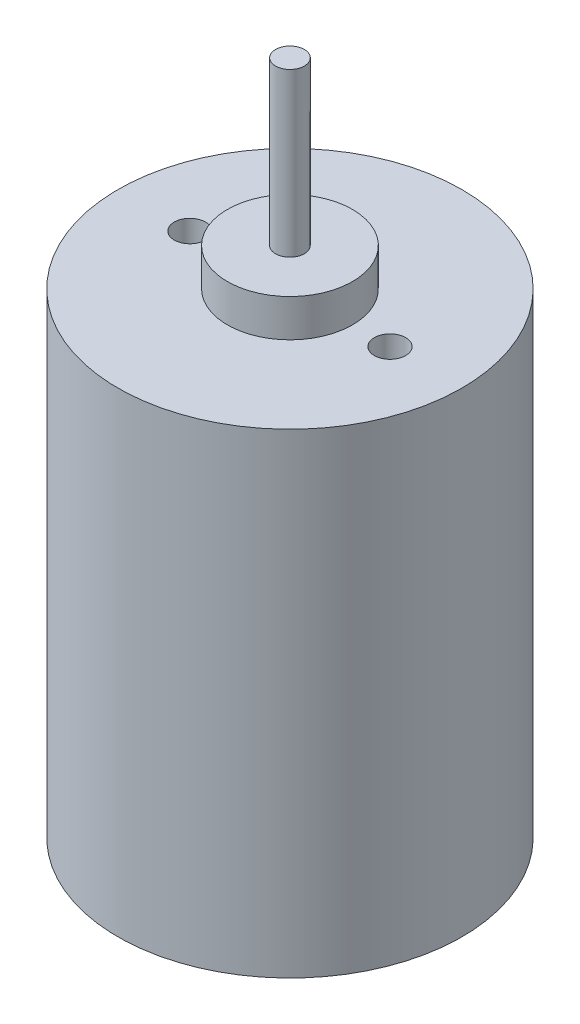
ISO-10303-21;
HEADER;
FILE_DESCRIPTION(('STEP AP214'),'2;1');
FILE_NAME('part.step','',(''),(''),'','','');
FILE_SCHEMA(('AUTOMOTIVE_DESIGN { 1 0 10303 214 1 1 1 1 }'));
ENDSEC;
DATA;
#1=APPLICATION_CONTEXT('core data for automotive mechanical design processes');
#2=APPLICATION_PROTOCOL_DEFINITION('international standard','automotive_design',2000,#1);
#3=PRODUCT_CONTEXT('',#1,'mechanical');
#4=PRODUCT('Part','Part','',(#3));
#5=PRODUCT_RELATED_PRODUCT_CATEGORY('part','',(#4));
#6=PRODUCT_DEFINITION_FORMATION('','',#4);
#7=PRODUCT_DEFINITION_CONTEXT('part definition',#1,'design');
#8=PRODUCT_DEFINITION('design','',#6,#7);
#9=PRODUCT_DEFINITION_SHAPE('','',#8);
#10=(LENGTH_UNIT() NAMED_UNIT(*) SI_UNIT(.MILLI.,.METRE.));
#11=(NAMED_UNIT(*) PLANE_ANGLE_UNIT() SI_UNIT($,.RADIAN.));
#12=(NAMED_UNIT(*) SI_UNIT($,.STERADIAN.) SOLID_ANGLE_UNIT());
#13=UNCERTAINTY_MEASURE_WITH_UNIT(LENGTH_MEASURE(1.E-05),#10,'distance_accuracy_value','');
#14=(GEOMETRIC_REPRESENTATION_CONTEXT(3) GLOBAL_UNCERTAINTY_ASSIGNED_CONTEXT((#13)) GLOBAL_UNIT_ASSIGNED_CONTEXT((#10,
#11,#12)) REPRESENTATION_CONTEXT('',''));
#15=CARTESIAN_POINT('',(0.,0.,0.));
#16=DIRECTION('',(0.,0.,1.));
#17=DIRECTION('',(1.,0.,0.));
#18=AXIS2_PLACEMENT_3D('',#15,#16,#17);
#19=CARTESIAN_POINT('',(0.,57.,0.));
#20=DIRECTION('',(0.,-1.,0.));
#21=DIRECTION('',(0.,0.,-1.));
#22=AXIS2_PLACEMENT_3D('',#19,#20,#21);
#23=PLANE('',#22);
#24=CARTESIAN_POINT('',(0.,57.,0.));
#25=DIRECTION('',(0.,-1.,0.));
#26=DIRECTION('',(0.,0.,-1.));
#27=AXIS2_PLACEMENT_3D('',#24,#25,#26);
#28=CIRCLE('',#27,1.15);
#29=CARTESIAN_POINT('',(0.,57.,-1.15));
#30=VERTEX_POINT('',#29);
#31=EDGE_CURVE('E10',#30,#30,#28,.T.);
#32=ORIENTED_EDGE('',*,*,#31,.F.);
#33=EDGE_LOOP('',(#32));
#34=FACE_BOUND('',#33,.T.);
#35=ADVANCED_FACE('F35',(#34),#23,.F.);
#36=CARTESIAN_POINT('',(0.,0.,0.));
#37=DIRECTION('',(0.,-1.,0.));
#38=DIRECTION('',(0.,0.,-1.));
#39=AXIS2_PLACEMENT_3D('',#36,#37,#38);
#40=CYLINDRICAL_SURFACE('',#39,1.15);
#41=CARTESIAN_POINT('',(0.,44.,0.));
#42=DIRECTION('',(0.,-1.,0.));
#43=DIRECTION('',(0.,0.,-1.));
#44=AXIS2_PLACEMENT_3D('',#41,#42,#43);
#45=CIRCLE('',#44,1.15);
#46=CARTESIAN_POINT('',(0.,44.,-1.15));
#47=VERTEX_POINT('',#46);
#48=EDGE_CURVE('E41',#47,#47,#45,.T.);
#49=ORIENTED_EDGE('',*,*,#48,.F.);
#50=EDGE_LOOP('',(#49));
#51=FACE_BOUND('',#50,.T.);
#52=ORIENTED_EDGE('',*,*,#31,.T.);
#53=EDGE_LOOP('',(#52));
#54=FACE_BOUND('',#53,.T.);
#55=ADVANCED_FACE('F107',(#51,#54),#40,.T.);
#56=CARTESIAN_POINT('',(0.,44.,1.15));
#57=DIRECTION('',(0.,-1.,0.));
#58=DIRECTION('',(0.,0.,-1.));
#59=AXIS2_PLACEMENT_3D('',#56,#57,#58);
#60=PLANE('',#59);
#61=CARTESIAN_POINT('',(0.,44.,0.));
#62=DIRECTION('',(0.,-1.,0.));
#63=DIRECTION('',(0.,0.,-1.));
#64=AXIS2_PLACEMENT_3D('',#61,#62,#63);
#65=CIRCLE('',#64,5.);
#66=CARTESIAN_POINT('',(0.,44.,-5.));
#67=VERTEX_POINT('',#66);
#68=EDGE_CURVE('E45',#67,#67,#65,.T.);
#69=ORIENTED_EDGE('',*,*,#68,.F.);
#70=EDGE_LOOP('',(#69));
#71=FACE_BOUND('',#70,.T.);
#72=ORIENTED_EDGE('',*,*,#48,.T.);
#73=EDGE_LOOP('',(#72));
#74=FACE_BOUND('',#73,.T.);
#75=ADVANCED_FACE('F102',(#71,#74),#60,.F.);
#76=CARTESIAN_POINT('',(0.,0.,0.));
#77=DIRECTION('',(0.,-1.,0.));
#78=DIRECTION('',(0.,0.,-1.));
#79=AXIS2_PLACEMENT_3D('',#76,#77,#78);
#80=CYLINDRICAL_SURFACE('',#79,5.);
#81=CARTESIAN_POINT('',(0.,41.,0.));
#82=DIRECTION('',(0.,-1.,0.));
#83=DIRECTION('',(0.,0.,-1.));
#84=AXIS2_PLACEMENT_3D('',#81,#82,#83);
#85=CIRCLE('',#84,5.);
#86=CARTESIAN_POINT('',(0.,41.,-5.));
#87=VERTEX_POINT('',#86);
#88=EDGE_CURVE('E49',#87,#87,#85,.T.);
#89=ORIENTED_EDGE('',*,*,#88,.F.);
#90=EDGE_LOOP('',(#89));
#91=FACE_BOUND('',#90,.T.);
#92=ORIENTED_EDGE('',*,*,#68,.T.);
#93=EDGE_LOOP('',(#92));
#94=FACE_BOUND('',#93,.T.);
#95=ADVANCED_FACE('F92',(#91,#94),#80,.T.);
#96=CARTESIAN_POINT('',(0.,41.,5.));
#97=DIRECTION('',(0.,-1.,0.));
#98=DIRECTION('',(0.,0.,-1.));
#99=AXIS2_PLACEMENT_3D('',#96,#97,#98);
#100=PLANE('',#99);
#101=CARTESIAN_POINT('',(-8.,41.,0.));
#102=DIRECTION('',(0.,1.,0.));
#103=DIRECTION('',(0.,0.,1.));
#104=AXIS2_PLACEMENT_3D('',#101,#102,#103);
#105=CIRCLE('',#104,1.25);
#106=CARTESIAN_POINT('',(-8.,41.,1.25));
#107=VERTEX_POINT('',#106);
#108=EDGE_CURVE('E73',#107,#107,#105,.T.);
#109=ORIENTED_EDGE('',*,*,#108,.F.);
#110=EDGE_LOOP('',(#109));
#111=FACE_BOUND('',#110,.T.);
#112=CARTESIAN_POINT('',(8.,41.,0.));
#113=DIRECTION('',(0.,1.,0.));
#114=DIRECTION('',(0.,0.,1.));
#115=AXIS2_PLACEMENT_3D('',#112,#113,#114);
#116=CIRCLE('',#115,1.25);
#117=CARTESIAN_POINT('',(8.,41.,1.25));
#118=VERTEX_POINT('',#117);
#119=EDGE_CURVE('E70',#118,#118,#116,.T.);
#120=ORIENTED_EDGE('',*,*,#119,.F.);
#121=EDGE_LOOP('',(#120));
#122=FACE_BOUND('',#121,.T.);
#123=CARTESIAN_POINT('',(0.,41.,0.));
#124=DIRECTION('',(0.,-1.,0.));
#125=DIRECTION('',(0.,0.,-1.));
#126=AXIS2_PLACEMENT_3D('',#123,#124,#125);
#127=CIRCLE('',#126,13.75);
#128=CARTESIAN_POINT('',(0.,41.,-13.75));
#129=VERTEX_POINT('',#128);
#130=EDGE_CURVE('E54',#129,#129,#127,.T.);
#131=ORIENTED_EDGE('',*,*,#130,.F.);
#132=EDGE_LOOP('',(#131));
#133=FACE_BOUND('',#132,.T.);
#134=ORIENTED_EDGE('',*,*,#88,.T.);
#135=EDGE_LOOP('',(#134));
#136=FACE_BOUND('',#135,.T.);
#137=ADVANCED_FACE('F88',(#111,#122,#133,#136),#100,.F.);
#138=CARTESIAN_POINT('',(0.,0.,0.));
#139=DIRECTION('',(0.,-1.,0.));
#140=DIRECTION('',(0.,0.,-1.));
#141=AXIS2_PLACEMENT_3D('',#138,#139,#140);
#142=CYLINDRICAL_SURFACE('',#141,13.75);
#143=CARTESIAN_POINT('',(0.,3.,0.));
#144=DIRECTION('',(0.,-1.,0.));
#145=DIRECTION('',(0.,0.,-1.));
#146=AXIS2_PLACEMENT_3D('',#143,#144,#145);
#147=CIRCLE('',#146,13.75);
#148=CARTESIAN_POINT('',(0.,3.,-13.75));
#149=VERTEX_POINT('',#148);
#150=EDGE_CURVE('E57',#149,#149,#147,.T.);
#151=ORIENTED_EDGE('',*,*,#150,.F.);
#152=EDGE_LOOP('',(#151));
#153=FACE_BOUND('',#152,.T.);
#154=ORIENTED_EDGE('',*,*,#130,.T.);
#155=EDGE_LOOP('',(#154));
#156=FACE_BOUND('',#155,.T.);
#157=ADVANCED_FACE('F91',(#153,#156),#142,.T.);
#158=CARTESIAN_POINT('',(0.,3.,13.75));
#159=DIRECTION('',(0.,1.,0.));
#160=DIRECTION('',(0.,0.,1.));
#161=AXIS2_PLACEMENT_3D('',#158,#159,#160);
#162=PLANE('',#161);
#163=CARTESIAN_POINT('',(0.,3.,0.));
#164=DIRECTION('',(0.,-1.,0.));
#165=DIRECTION('',(0.,0.,-1.));
#166=AXIS2_PLACEMENT_3D('',#163,#164,#165);
#167=CIRCLE('',#166,5.);
#168=CARTESIAN_POINT('',(0.,3.,-5.));
#169=VERTEX_POINT('',#168);
#170=EDGE_CURVE('E60',#169,#169,#167,.T.);
#171=ORIENTED_EDGE('',*,*,#170,.F.);
#172=EDGE_LOOP('',(#171));
#173=FACE_BOUND('',#172,.T.);
#174=ORIENTED_EDGE('',*,*,#150,.T.);
#175=EDGE_LOOP('',(#174));
#176=FACE_BOUND('',#175,.T.);
#177=ADVANCED_FACE('F144',(#173,#176),#162,.F.);
#178=CARTESIAN_POINT('',(0.,0.,0.));
#179=DIRECTION('',(0.,-1.,0.));
#180=DIRECTION('',(0.,0.,-1.));
#181=AXIS2_PLACEMENT_3D('',#178,#179,#180);
#182=CYLINDRICAL_SURFACE('',#181,5.);
#183=CARTESIAN_POINT('',(0.,0.,0.));
#184=DIRECTION('',(0.,-1.,0.));
#185=DIRECTION('',(0.,0.,-1.));
#186=AXIS2_PLACEMENT_3D('',#183,#184,#185);
#187=CIRCLE('',#186,4.99999999999999);
#188=CARTESIAN_POINT('',(0.,0.,-4.99999999999999));
#189=VERTEX_POINT('',#188);
#190=EDGE_CURVE('E63',#189,#189,#187,.T.);
#191=ORIENTED_EDGE('',*,*,#190,.F.);
#192=EDGE_LOOP('',(#191));
#193=FACE_BOUND('',#192,.T.);
#194=ORIENTED_EDGE('',*,*,#170,.T.);
#195=EDGE_LOOP('',(#194));
#196=FACE_BOUND('',#195,.T.);
#197=ADVANCED_FACE('F155',(#193,#196),#182,.T.);
#198=CARTESIAN_POINT('',(0.,0.,4.99999999999999));
#199=DIRECTION('',(0.,1.,0.));
#200=DIRECTION('',(0.,0.,1.));
#201=AXIS2_PLACEMENT_3D('',#198,#199,#200);
#202=PLANE('',#201);
#203=ORIENTED_EDGE('',*,*,#190,.T.);
#204=EDGE_LOOP('',(#203));
#205=FACE_BOUND('',#204,.T.);
#206=ADVANCED_FACE('F166',(#205),#202,.F.);
#207=CARTESIAN_POINT('',(8.,31.,0.));
#208=DIRECTION('',(0.,1.,0.));
#209=DIRECTION('',(0.,0.,1.));
#210=AXIS2_PLACEMENT_3D('',#207,#208,#209);
#211=CYLINDRICAL_SURFACE('',#210,1.25);
#212=CARTESIAN_POINT('',(8.,31.,0.));
#213=DIRECTION('',(0.,1.,0.));
#214=DIRECTION('',(0.,0.,1.));
#215=AXIS2_PLACEMENT_3D('',#212,#213,#214);
#216=CIRCLE('',#215,1.25);
#217=CARTESIAN_POINT('',(8.,31.,1.25));
#218=VERTEX_POINT('',#217);
#219=EDGE_CURVE('E67',#218,#218,#216,.T.);
#220=ORIENTED_EDGE('',*,*,#219,.F.);
#221=EDGE_LOOP('',(#220));
#222=FACE_BOUND('',#221,.T.);
#223=ORIENTED_EDGE('',*,*,#119,.T.);
#224=EDGE_LOOP('',(#223));
#225=FACE_BOUND('',#224,.T.);
#226=ADVANCED_FACE('F177',(#222,#225),#211,.F.);
#227=CARTESIAN_POINT('',(8.,31.,0.));
#228=DIRECTION('',(0.,1.,0.));
#229=DIRECTION('',(0.,0.,1.));
#230=AXIS2_PLACEMENT_3D('',#227,#228,#229);
#231=PLANE('',#230);
#232=ORIENTED_EDGE('',*,*,#219,.T.);
#233=EDGE_LOOP('',(#232));
#234=FACE_BOUND('',#233,.T.);
#235=ADVANCED_FACE('F84',(#234),#231,.T.);
#236=CARTESIAN_POINT('',(-8.,31.,0.));
#237=DIRECTION('',(0.,1.,0.));
#238=DIRECTION('',(0.,0.,1.));
#239=AXIS2_PLACEMENT_3D('',#236,#237,#238);
#240=CYLINDRICAL_SURFACE('',#239,1.25);
#241=CARTESIAN_POINT('',(-8.,31.,0.));
#242=DIRECTION('',(0.,1.,0.));
#243=DIRECTION('',(0.,0.,1.));
#244=AXIS2_PLACEMENT_3D('',#241,#242,#243);
#245=CIRCLE('',#244,1.25);
#246=CARTESIAN_POINT('',(-8.,31.,1.25));
#247=VERTEX_POINT('',#246);
#248=EDGE_CURVE('E66',#247,#247,#245,.T.);
#249=ORIENTED_EDGE('',*,*,#248,.F.);
#250=EDGE_LOOP('',(#249));
#251=FACE_BOUND('',#250,.T.);
#252=ORIENTED_EDGE('',*,*,#108,.T.);
#253=EDGE_LOOP('',(#252));
#254=FACE_BOUND('',#253,.T.);
#255=ADVANCED_FACE('F81',(#251,#254),#240,.F.);
#256=CARTESIAN_POINT('',(-8.,31.,0.));
#257=DIRECTION('',(0.,1.,0.));
#258=DIRECTION('',(0.,0.,1.));
#259=AXIS2_PLACEMENT_3D('',#256,#257,#258);
#260=PLANE('',#259);
#261=ORIENTED_EDGE('',*,*,#248,.T.);
#262=EDGE_LOOP('',(#261));
#263=FACE_BOUND('',#262,.T.);
#264=ADVANCED_FACE('F79',(#263),#260,.T.);
#265=CLOSED_SHELL('',(#35,#55,#75,#95,#137,#157,#177,#197,#206,#226,#235,#255,#264));
#266=MANIFOLD_SOLID_BREP('B2',#265);
#267=ADVANCED_BREP_SHAPE_REPRESENTATION('',(#18,#266),#14);
#268=SHAPE_DEFINITION_REPRESENTATION(#9,#267);
ENDSEC;
END-ISO-10303-21;
